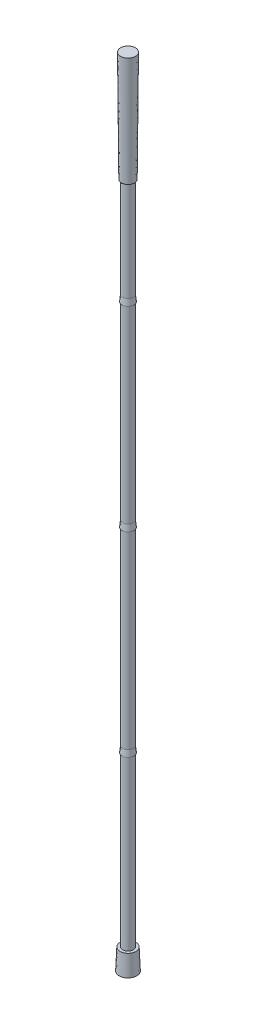
ISO-10303-21;
HEADER;
FILE_DESCRIPTION(('STEP AP214'),'2;1');
FILE_NAME('part.step','',(''),(''),'','','');
FILE_SCHEMA(('AUTOMOTIVE_DESIGN { 1 0 10303 214 1 1 1 1 }'));
ENDSEC;
DATA;
#1=APPLICATION_CONTEXT('core data for automotive mechanical design processes');
#2=APPLICATION_PROTOCOL_DEFINITION('international standard','automotive_design',2000,#1);
#3=PRODUCT_CONTEXT('',#1,'mechanical');
#4=PRODUCT('Part','Part','',(#3));
#5=PRODUCT_RELATED_PRODUCT_CATEGORY('part','',(#4));
#6=PRODUCT_DEFINITION_FORMATION('','',#4);
#7=PRODUCT_DEFINITION_CONTEXT('part definition',#1,'design');
#8=PRODUCT_DEFINITION('design','',#6,#7);
#9=PRODUCT_DEFINITION_SHAPE('','',#8);
#10=(LENGTH_UNIT() NAMED_UNIT(*) SI_UNIT(.MILLI.,.METRE.));
#11=(NAMED_UNIT(*) PLANE_ANGLE_UNIT() SI_UNIT($,.RADIAN.));
#12=(NAMED_UNIT(*) SI_UNIT($,.STERADIAN.) SOLID_ANGLE_UNIT());
#13=UNCERTAINTY_MEASURE_WITH_UNIT(LENGTH_MEASURE(1.E-05),#10,'distance_accuracy_value','');
#14=(GEOMETRIC_REPRESENTATION_CONTEXT(3) GLOBAL_UNCERTAINTY_ASSIGNED_CONTEXT((#13)) GLOBAL_UNIT_ASSIGNED_CONTEXT((#10,
#11,#12)) REPRESENTATION_CONTEXT('',''));
#15=CARTESIAN_POINT('',(0.,0.,0.));
#16=DIRECTION('',(0.,0.,1.));
#17=DIRECTION('',(1.,0.,0.));
#18=AXIS2_PLACEMENT_3D('',#15,#16,#17);
#19=CARTESIAN_POINT('',(0.,-1184.275,0.));
#20=DIRECTION('',(0.,-1.,0.));
#21=DIRECTION('',(1.,0.,0.));
#22=AXIS2_PLACEMENT_3D('',#19,#20,#21);
#23=PLANE('',#22);
#24=CARTESIAN_POINT('',(0.,-1184.275,0.));
#25=DIRECTION('',(0.,1.,0.));
#26=DIRECTION('',(-1.,0.,0.));
#27=AXIS2_PLACEMENT_3D('',#24,#25,#26);
#28=CIRCLE('',#27,8.1026);
#29=CARTESIAN_POINT('',(-8.10259999999997,-1184.275,0.));
#30=VERTEX_POINT('',#29);
#31=EDGE_CURVE('E10',#30,#30,#28,.T.);
#32=ORIENTED_EDGE('',*,*,#31,.F.);
#33=EDGE_LOOP('',(#32));
#34=FACE_BOUND('',#33,.T.);
#35=CARTESIAN_POINT('',(0.,-1184.275,0.));
#36=DIRECTION('',(0.,1.,0.));
#37=DIRECTION('',(-1.,0.,0.));
#38=AXIS2_PLACEMENT_3D('',#35,#36,#37);
#39=CIRCLE('',#38,12.0840499999999);
#40=CARTESIAN_POINT('',(-12.0840499999999,-1184.275,0.));
#41=VERTEX_POINT('',#40);
#42=EDGE_CURVE('E39',#41,#41,#39,.T.);
#43=ORIENTED_EDGE('',*,*,#42,.T.);
#44=EDGE_LOOP('',(#43));
#45=FACE_BOUND('',#44,.T.);
#46=ADVANCED_FACE('F36',(#34,#45),#23,.F.);
#47=CARTESIAN_POINT('',(0.,-1216.025,0.));
#48=DIRECTION('',(0.,-1.,0.));
#49=DIRECTION('',(1.,0.,0.));
#50=AXIS2_PLACEMENT_3D('',#47,#48,#49);
#51=CONICAL_SURFACE('',#50,13.3985,0.0413763716460788);
#52=ORIENTED_EDGE('',*,*,#42,.F.);
#53=EDGE_LOOP('',(#52));
#54=FACE_BOUND('',#53,.T.);
#55=CARTESIAN_POINT('',(0.,-1216.025,0.));
#56=DIRECTION('',(0.,1.,0.));
#57=DIRECTION('',(-1.,0.,0.));
#58=AXIS2_PLACEMENT_3D('',#55,#56,#57);
#59=CIRCLE('',#58,13.3985);
#60=CARTESIAN_POINT('',(-13.3985,-1216.025,0.));
#61=VERTEX_POINT('',#60);
#62=EDGE_CURVE('E47',#61,#61,#59,.T.);
#63=ORIENTED_EDGE('',*,*,#62,.T.);
#64=EDGE_LOOP('',(#63));
#65=FACE_BOUND('',#64,.T.);
#66=ADVANCED_FACE('F117',(#54,#65),#51,.T.);
#67=CARTESIAN_POINT('',(0.,-1216.025,0.));
#68=DIRECTION('',(0.,1.,0.));
#69=DIRECTION('',(-1.,0.,0.));
#70=AXIS2_PLACEMENT_3D('',#67,#68,#69);
#71=PLANE('',#70);
#72=ORIENTED_EDGE('',*,*,#62,.F.);
#73=EDGE_LOOP('',(#72));
#74=FACE_BOUND('',#73,.T.);
#75=ADVANCED_FACE('F122',(#74),#71,.F.);
#76=CARTESIAN_POINT('',(0.,-927.1,0.));
#77=DIRECTION('',(0.,1.,0.));
#78=DIRECTION('',(-1.,0.,0.));
#79=AXIS2_PLACEMENT_3D('',#76,#77,#78);
#80=CYLINDRICAL_SURFACE('',#79,8.10259999999998);
#81=CARTESIAN_POINT('',(0.,-927.1,0.));
#82=DIRECTION('',(0.,1.,0.));
#83=DIRECTION('',(-1.,0.,0.));
#84=AXIS2_PLACEMENT_3D('',#81,#82,#83);
#85=CIRCLE('',#84,8.10259999999996);
#86=CARTESIAN_POINT('',(-8.10259999999993,-927.1,0.));
#87=VERTEX_POINT('',#86);
#88=EDGE_CURVE('E49',#87,#87,#85,.T.);
#89=ORIENTED_EDGE('',*,*,#88,.F.);
#90=EDGE_LOOP('',(#89));
#91=FACE_BOUND('',#90,.T.);
#92=ORIENTED_EDGE('',*,*,#31,.T.);
#93=EDGE_LOOP('',(#92));
#94=FACE_BOUND('',#93,.T.);
#95=ADVANCED_FACE('F129',(#91,#94),#80,.T.);
#96=CARTESIAN_POINT('',(0.,-168.275,0.));
#97=DIRECTION('',(0.,1.,0.));
#98=DIRECTION('',(-1.,0.,0.));
#99=AXIS2_PLACEMENT_3D('',#96,#97,#98);
#100=PLANE('',#99);
#101=CARTESIAN_POINT('',(0.,-168.275,0.));
#102=DIRECTION('',(0.,1.,0.));
#103=DIRECTION('',(-1.,0.,0.));
#104=AXIS2_PLACEMENT_3D('',#101,#102,#103);
#105=CIRCLE('',#104,8.07085);
#106=CARTESIAN_POINT('',(-8.07084999999998,-168.275,0.));
#107=VERTEX_POINT('',#106);
#108=EDGE_CURVE('E63',#107,#107,#105,.T.);
#109=ORIENTED_EDGE('',*,*,#108,.T.);
#110=EDGE_LOOP('',(#109));
#111=FACE_BOUND('',#110,.T.);
#112=CARTESIAN_POINT('',(0.,-168.275,0.));
#113=DIRECTION('',(0.,1.,0.));
#114=DIRECTION('',(-1.,0.,0.));
#115=AXIS2_PLACEMENT_3D('',#112,#113,#114);
#116=CIRCLE('',#115,9.94705236216742);
#117=CARTESIAN_POINT('',(-9.9470523621674,-168.275,0.));
#118=VERTEX_POINT('',#117);
#119=EDGE_CURVE('E55',#118,#118,#116,.T.);
#120=ORIENTED_EDGE('',*,*,#119,.F.);
#121=EDGE_LOOP('',(#120));
#122=FACE_BOUND('',#121,.T.);
#123=ADVANCED_FACE('F135',(#111,#122),#100,.F.);
#124=CARTESIAN_POINT('',(0.,-168.275,0.));
#125=DIRECTION('',(0.,1.,0.));
#126=DIRECTION('',(-1.,0.,0.));
#127=AXIS2_PLACEMENT_3D('',#124,#125,#126);
#128=CONICAL_SURFACE('',#127,9.94705236216742,0.00836623340211224);
#129=CARTESIAN_POINT('',(0.,0.,0.));
#130=DIRECTION('',(0.,1.,0.));
#131=DIRECTION('',(-1.,0.,0.));
#132=AXIS2_PLACEMENT_3D('',#129,#130,#131);
#133=CIRCLE('',#132,11.354913135265);
#134=CARTESIAN_POINT('',(-11.354913135265,0.,0.));
#135=VERTEX_POINT('',#134);
#136=EDGE_CURVE('E59',#135,#135,#133,.T.);
#137=ORIENTED_EDGE('',*,*,#136,.F.);
#138=EDGE_LOOP('',(#137));
#139=FACE_BOUND('',#138,.T.);
#140=ORIENTED_EDGE('',*,*,#119,.T.);
#141=EDGE_LOOP('',(#140));
#142=FACE_BOUND('',#141,.T.);
#143=ADVANCED_FACE('F139',(#139,#142),#128,.T.);
#144=CARTESIAN_POINT('',(0.,0.,0.));
#145=DIRECTION('',(0.,-1.,0.));
#146=DIRECTION('',(1.,0.,0.));
#147=AXIS2_PLACEMENT_3D('',#144,#145,#146);
#148=PLANE('',#147);
#149=ORIENTED_EDGE('',*,*,#136,.T.);
#150=EDGE_LOOP('',(#149));
#151=FACE_BOUND('',#150,.T.);
#152=ADVANCED_FACE('F143',(#151),#148,.F.);
#153=CARTESIAN_POINT('',(0.,-168.275,0.));
#154=DIRECTION('',(0.,1.,0.));
#155=DIRECTION('',(-1.,0.,0.));
#156=AXIS2_PLACEMENT_3D('',#153,#154,#155);
#157=CYLINDRICAL_SURFACE('',#156,8.07085);
#158=ORIENTED_EDGE('',*,*,#108,.F.);
#159=EDGE_LOOP('',(#158));
#160=FACE_BOUND('',#159,.T.);
#161=CARTESIAN_POINT('',(0.,-320.675,0.));
#162=DIRECTION('',(0.,1.,0.));
#163=DIRECTION('',(-1.,0.,0.));
#164=AXIS2_PLACEMENT_3D('',#161,#162,#163);
#165=CIRCLE('',#164,8.07085);
#166=CARTESIAN_POINT('',(-8.07084999999998,-320.675,0.));
#167=VERTEX_POINT('',#166);
#168=EDGE_CURVE('E68',#167,#167,#165,.T.);
#169=ORIENTED_EDGE('',*,*,#168,.T.);
#170=EDGE_LOOP('',(#169));
#171=FACE_BOUND('',#170,.T.);
#172=ADVANCED_FACE('F147',(#160,#171),#157,.T.);
#173=CARTESIAN_POINT('',(0.,-330.2,0.));
#174=DIRECTION('',(0.,-1.,0.));
#175=DIRECTION('',(1.,0.,0.));
#176=AXIS2_PLACEMENT_3D('',#173,#174,#175);
#177=CONICAL_SURFACE('',#176,9.14399999999998,0.112193543031967);
#178=ORIENTED_EDGE('',*,*,#168,.F.);
#179=EDGE_LOOP('',(#178));
#180=FACE_BOUND('',#179,.T.);
#181=CARTESIAN_POINT('',(0.,-330.2,0.));
#182=DIRECTION('',(0.,1.,0.));
#183=DIRECTION('',(-1.,0.,0.));
#184=AXIS2_PLACEMENT_3D('',#181,#182,#183);
#185=CIRCLE('',#184,9.14399999999998);
#186=CARTESIAN_POINT('',(-9.14399999999996,-330.2,0.));
#187=VERTEX_POINT('',#186);
#188=EDGE_CURVE('E71',#187,#187,#185,.T.);
#189=ORIENTED_EDGE('',*,*,#188,.T.);
#190=EDGE_LOOP('',(#189));
#191=FACE_BOUND('',#190,.T.);
#192=ADVANCED_FACE('F151',(#180,#191),#177,.T.);
#193=CARTESIAN_POINT('',(0.,-330.2,0.));
#194=DIRECTION('',(0.,1.,0.));
#195=DIRECTION('',(-1.,0.,0.));
#196=AXIS2_PLACEMENT_3D('',#193,#194,#195);
#197=PLANE('',#196);
#198=CARTESIAN_POINT('',(0.,-330.2,0.));
#199=DIRECTION('',(0.,1.,0.));
#200=DIRECTION('',(-1.,0.,0.));
#201=AXIS2_PLACEMENT_3D('',#198,#199,#200);
#202=CIRCLE('',#201,8.06449999999998);
#203=CARTESIAN_POINT('',(-8.06449999999996,-330.2,0.));
#204=VERTEX_POINT('',#203);
#205=EDGE_CURVE('E74',#204,#204,#202,.T.);
#206=ORIENTED_EDGE('',*,*,#205,.T.);
#207=EDGE_LOOP('',(#206));
#208=FACE_BOUND('',#207,.T.);
#209=ORIENTED_EDGE('',*,*,#188,.F.);
#210=EDGE_LOOP('',(#209));
#211=FACE_BOUND('',#210,.T.);
#212=ADVANCED_FACE('F155',(#208,#211),#197,.F.);
#213=CARTESIAN_POINT('',(0.,-330.2,0.));
#214=DIRECTION('',(0.,1.,0.));
#215=DIRECTION('',(-1.,0.,0.));
#216=AXIS2_PLACEMENT_3D('',#213,#214,#215);
#217=CYLINDRICAL_SURFACE('',#216,8.06449999999997);
#218=ORIENTED_EDGE('',*,*,#205,.F.);
#219=EDGE_LOOP('',(#218));
#220=FACE_BOUND('',#219,.T.);
#221=CARTESIAN_POINT('',(0.,-619.125,0.));
#222=DIRECTION('',(0.,1.,0.));
#223=DIRECTION('',(-1.,0.,0.));
#224=AXIS2_PLACEMENT_3D('',#221,#222,#223);
#225=CIRCLE('',#224,8.06449999999997);
#226=CARTESIAN_POINT('',(-8.06449999999993,-619.125,0.));
#227=VERTEX_POINT('',#226);
#228=EDGE_CURVE('E77',#227,#227,#225,.T.);
#229=ORIENTED_EDGE('',*,*,#228,.T.);
#230=EDGE_LOOP('',(#229));
#231=FACE_BOUND('',#230,.T.);
#232=ADVANCED_FACE('F159',(#220,#231),#217,.T.);
#233=CARTESIAN_POINT('',(0.,-628.65,0.));
#234=DIRECTION('',(0.,-1.,0.));
#235=DIRECTION('',(1.,0.,0.));
#236=AXIS2_PLACEMENT_3D('',#233,#234,#235);
#237=CONICAL_SURFACE('',#236,9.14399999999996,0.112851804336882);
#238=ORIENTED_EDGE('',*,*,#228,.F.);
#239=EDGE_LOOP('',(#238));
#240=FACE_BOUND('',#239,.T.);
#241=CARTESIAN_POINT('',(0.,-628.65,0.));
#242=DIRECTION('',(0.,1.,0.));
#243=DIRECTION('',(-1.,0.,0.));
#244=AXIS2_PLACEMENT_3D('',#241,#242,#243);
#245=CIRCLE('',#244,9.14399999999996);
#246=CARTESIAN_POINT('',(-9.14399999999993,-628.65,0.));
#247=VERTEX_POINT('',#246);
#248=EDGE_CURVE('E80',#247,#247,#245,.T.);
#249=ORIENTED_EDGE('',*,*,#248,.T.);
#250=EDGE_LOOP('',(#249));
#251=FACE_BOUND('',#250,.T.);
#252=ADVANCED_FACE('F114',(#240,#251),#237,.T.);
#253=CARTESIAN_POINT('',(0.,-628.65,0.));
#254=DIRECTION('',(0.,1.,0.));
#255=DIRECTION('',(-1.,0.,0.));
#256=AXIS2_PLACEMENT_3D('',#253,#254,#255);
#257=PLANE('',#256);
#258=CARTESIAN_POINT('',(0.,-628.65,0.));
#259=DIRECTION('',(0.,1.,0.));
#260=DIRECTION('',(-1.,0.,0.));
#261=AXIS2_PLACEMENT_3D('',#258,#259,#260);
#262=CIRCLE('',#261,8.04544999999996);
#263=CARTESIAN_POINT('',(-8.04544999999993,-628.65,0.));
#264=VERTEX_POINT('',#263);
#265=EDGE_CURVE('E89',#264,#264,#262,.T.);
#266=ORIENTED_EDGE('',*,*,#265,.T.);
#267=EDGE_LOOP('',(#266));
#268=FACE_BOUND('',#267,.T.);
#269=ORIENTED_EDGE('',*,*,#248,.F.);
#270=EDGE_LOOP('',(#269));
#271=FACE_BOUND('',#270,.T.);
#272=ADVANCED_FACE('F93',(#268,#271),#257,.F.);
#273=CARTESIAN_POINT('',(0.,-927.1,0.));
#274=DIRECTION('',(0.,1.,0.));
#275=DIRECTION('',(-1.,0.,0.));
#276=AXIS2_PLACEMENT_3D('',#273,#274,#275);
#277=PLANE('',#276);
#278=ORIENTED_EDGE('',*,*,#88,.T.);
#279=EDGE_LOOP('',(#278));
#280=FACE_BOUND('',#279,.T.);
#281=CARTESIAN_POINT('',(0.,-927.1,0.));
#282=DIRECTION('',(0.,1.,0.));
#283=DIRECTION('',(-1.,0.,0.));
#284=AXIS2_PLACEMENT_3D('',#281,#282,#283);
#285=CIRCLE('',#284,9.144);
#286=CARTESIAN_POINT('',(-9.14399999999996,-927.1,0.));
#287=VERTEX_POINT('',#286);
#288=EDGE_CURVE('E83',#287,#287,#285,.T.);
#289=ORIENTED_EDGE('',*,*,#288,.F.);
#290=EDGE_LOOP('',(#289));
#291=FACE_BOUND('',#290,.T.);
#292=ADVANCED_FACE('F105',(#280,#291),#277,.F.);
#293=CARTESIAN_POINT('',(0.,-927.1,0.));
#294=DIRECTION('',(0.,-1.,0.));
#295=DIRECTION('',(1.,0.,0.));
#296=AXIS2_PLACEMENT_3D('',#293,#294,#295);
#297=CONICAL_SURFACE('',#296,9.144,0.114825996848912);
#298=CARTESIAN_POINT('',(0.,-917.575,0.));
#299=DIRECTION('',(0.,1.,0.));
#300=DIRECTION('',(-1.,0.,0.));
#301=AXIS2_PLACEMENT_3D('',#298,#299,#300);
#302=CIRCLE('',#301,8.04545);
#303=CARTESIAN_POINT('',(-8.04544999999996,-917.575,0.));
#304=VERTEX_POINT('',#303);
#305=EDGE_CURVE('E86',#304,#304,#302,.T.);
#306=ORIENTED_EDGE('',*,*,#305,.F.);
#307=EDGE_LOOP('',(#306));
#308=FACE_BOUND('',#307,.T.);
#309=ORIENTED_EDGE('',*,*,#288,.T.);
#310=EDGE_LOOP('',(#309));
#311=FACE_BOUND('',#310,.T.);
#312=ADVANCED_FACE('F99',(#308,#311),#297,.T.);
#313=CARTESIAN_POINT('',(0.,-628.65,0.));
#314=DIRECTION('',(0.,1.,0.));
#315=DIRECTION('',(-1.,0.,0.));
#316=AXIS2_PLACEMENT_3D('',#313,#314,#315);
#317=CYLINDRICAL_SURFACE('',#316,8.04544999999998);
#318=ORIENTED_EDGE('',*,*,#265,.F.);
#319=EDGE_LOOP('',(#318));
#320=FACE_BOUND('',#319,.T.);
#321=ORIENTED_EDGE('',*,*,#305,.T.);
#322=EDGE_LOOP('',(#321));
#323=FACE_BOUND('',#322,.T.);
#324=ADVANCED_FACE('F96',(#320,#323),#317,.T.);
#325=CLOSED_SHELL('',(#46,#66,#75,#95,#123,#143,#152,#172,#192,#212,#232,#252,#272,#292,#312,#324));
#326=MANIFOLD_SOLID_BREP('B2',#325);
#327=ADVANCED_BREP_SHAPE_REPRESENTATION('',(#18,#326),#14);
#328=SHAPE_DEFINITION_REPRESENTATION(#9,#327);
ENDSEC;
END-ISO-10303-21;
